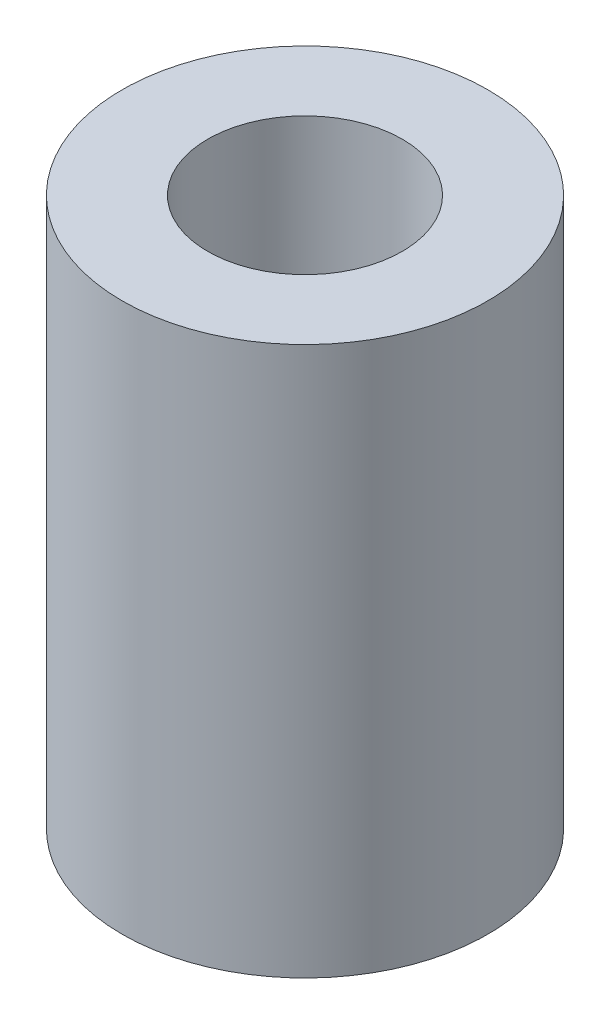
ISO-10303-21;
HEADER;
FILE_DESCRIPTION(('STEP AP214'),'2;1');
FILE_NAME('part.step','',(''),(''),'','','');
FILE_SCHEMA(('AUTOMOTIVE_DESIGN { 1 0 10303 214 1 1 1 1 }'));
ENDSEC;
DATA;
#1=APPLICATION_CONTEXT('core data for automotive mechanical design processes');
#2=APPLICATION_PROTOCOL_DEFINITION('international standard','automotive_design',2000,#1);
#3=PRODUCT_CONTEXT('',#1,'mechanical');
#4=PRODUCT('Part','Part','',(#3));
#5=PRODUCT_RELATED_PRODUCT_CATEGORY('part','',(#4));
#6=PRODUCT_DEFINITION_FORMATION('','',#4);
#7=PRODUCT_DEFINITION_CONTEXT('part definition',#1,'design');
#8=PRODUCT_DEFINITION('design','',#6,#7);
#9=PRODUCT_DEFINITION_SHAPE('','',#8);
#10=(LENGTH_UNIT() NAMED_UNIT(*) SI_UNIT(.MILLI.,.METRE.));
#11=(NAMED_UNIT(*) PLANE_ANGLE_UNIT() SI_UNIT($,.RADIAN.));
#12=(NAMED_UNIT(*) SI_UNIT($,.STERADIAN.) SOLID_ANGLE_UNIT());
#13=UNCERTAINTY_MEASURE_WITH_UNIT(LENGTH_MEASURE(1.E-05),#10,'distance_accuracy_value','');
#14=(GEOMETRIC_REPRESENTATION_CONTEXT(3) GLOBAL_UNCERTAINTY_ASSIGNED_CONTEXT((#13)) GLOBAL_UNIT_ASSIGNED_CONTEXT((#10,
#11,#12)) REPRESENTATION_CONTEXT('',''));
#15=CARTESIAN_POINT('',(0.,0.,0.));
#16=DIRECTION('',(0.,0.,1.));
#17=DIRECTION('',(1.,0.,0.));
#18=AXIS2_PLACEMENT_3D('',#15,#16,#17);
#19=CARTESIAN_POINT('',(0.,19.05,0.));
#20=DIRECTION('',(0.,1.,0.));
#21=DIRECTION('',(0.,0.,1.));
#22=AXIS2_PLACEMENT_3D('',#19,#20,#21);
#23=PLANE('',#22);
#24=CARTESIAN_POINT('',(0.,19.05,0.));
#25=DIRECTION('',(0.,1.,0.));
#26=DIRECTION('',(0.,0.,1.));
#27=AXIS2_PLACEMENT_3D('',#24,#25,#26);
#28=CIRCLE('',#27,6.35);
#29=CARTESIAN_POINT('',(0.,19.05,-6.35));
#30=VERTEX_POINT('',#29);
#31=EDGE_CURVE('E10',#30,#30,#28,.T.);
#32=ORIENTED_EDGE('',*,*,#31,.T.);
#33=EDGE_LOOP('',(#32));
#34=FACE_BOUND('',#33,.T.);
#35=CARTESIAN_POINT('',(0.,19.05,0.));
#36=DIRECTION('',(0.,1.,0.));
#37=DIRECTION('',(0.,0.,1.));
#38=AXIS2_PLACEMENT_3D('',#35,#36,#37);
#39=CIRCLE('',#38,3.3782);
#40=CARTESIAN_POINT('',(0.,19.05,-3.3782));
#41=VERTEX_POINT('',#40);
#42=EDGE_CURVE('E41',#41,#41,#39,.T.);
#43=ORIENTED_EDGE('',*,*,#42,.F.);
#44=EDGE_LOOP('',(#43));
#45=FACE_BOUND('',#44,.T.);
#46=ADVANCED_FACE('F30',(#34,#45),#23,.T.);
#47=CARTESIAN_POINT('',(0.,0.,0.));
#48=DIRECTION('',(0.,1.,0.));
#49=DIRECTION('',(0.,0.,1.));
#50=AXIS2_PLACEMENT_3D('',#47,#48,#49);
#51=PLANE('',#50);
#52=CARTESIAN_POINT('',(0.,0.,0.));
#53=DIRECTION('',(0.,1.,0.));
#54=DIRECTION('',(0.,0.,1.));
#55=AXIS2_PLACEMENT_3D('',#52,#53,#54);
#56=CIRCLE('',#55,6.35);
#57=CARTESIAN_POINT('',(0.,0.,-6.35));
#58=VERTEX_POINT('',#57);
#59=EDGE_CURVE('E34',#58,#58,#56,.T.);
#60=ORIENTED_EDGE('',*,*,#59,.F.);
#61=EDGE_LOOP('',(#60));
#62=FACE_BOUND('',#61,.T.);
#63=CARTESIAN_POINT('',(0.,0.,0.));
#64=DIRECTION('',(0.,1.,0.));
#65=DIRECTION('',(0.,0.,1.));
#66=AXIS2_PLACEMENT_3D('',#63,#64,#65);
#67=CIRCLE('',#66,3.3782);
#68=CARTESIAN_POINT('',(0.,0.,-3.3782));
#69=VERTEX_POINT('',#68);
#70=EDGE_CURVE('E43',#69,#69,#67,.T.);
#71=ORIENTED_EDGE('',*,*,#70,.T.);
#72=EDGE_LOOP('',(#71));
#73=FACE_BOUND('',#72,.T.);
#74=ADVANCED_FACE('F53',(#62,#73),#51,.F.);
#75=CARTESIAN_POINT('',(0.,19.05,0.));
#76=DIRECTION('',(0.,-1.,0.));
#77=DIRECTION('',(0.,0.,-1.));
#78=AXIS2_PLACEMENT_3D('',#75,#76,#77);
#79=CYLINDRICAL_SURFACE('',#78,6.35);
#80=CARTESIAN_POINT('',(0.,19.05,-6.35));
#81=CARTESIAN_POINT('',(0.,18.8515625,-6.35));
#82=CARTESIAN_POINT('',(0.,18.653125,-6.35));
#83=CARTESIAN_POINT('',(0.,18.25625,-6.35));
#84=CARTESIAN_POINT('',(0.,18.0578125,-6.35));
#85=CARTESIAN_POINT('',(0.,17.6609375,-6.35));
#86=CARTESIAN_POINT('',(0.,17.4625,-6.35));
#87=CARTESIAN_POINT('',(0.,17.065625,-6.35));
#88=CARTESIAN_POINT('',(0.,16.8671875,-6.35));
#89=CARTESIAN_POINT('',(0.,16.4703125,-6.35));
#90=CARTESIAN_POINT('',(0.,16.271875,-6.35));
#91=CARTESIAN_POINT('',(0.,15.875,-6.35));
#92=CARTESIAN_POINT('',(0.,15.6765625,-6.35));
#93=CARTESIAN_POINT('',(0.,15.2796875,-6.35));
#94=CARTESIAN_POINT('',(0.,15.08125,-6.35));
#95=CARTESIAN_POINT('',(0.,14.684375,-6.35));
#96=CARTESIAN_POINT('',(0.,14.4859375,-6.35));
#97=CARTESIAN_POINT('',(0.,14.0890625,-6.35));
#98=CARTESIAN_POINT('',(0.,13.890625,-6.35));
#99=CARTESIAN_POINT('',(0.,13.49375,-6.35));
#100=CARTESIAN_POINT('',(0.,13.2953125,-6.35));
#101=CARTESIAN_POINT('',(0.,12.8984375,-6.35));
#102=CARTESIAN_POINT('',(0.,12.7,-6.35));
#103=CARTESIAN_POINT('',(0.,12.303125,-6.35));
#104=CARTESIAN_POINT('',(0.,12.1046875,-6.35));
#105=CARTESIAN_POINT('',(0.,11.7078125,-6.35));
#106=CARTESIAN_POINT('',(0.,11.509375,-6.35));
#107=CARTESIAN_POINT('',(0.,11.1125,-6.35));
#108=CARTESIAN_POINT('',(0.,10.9140625,-6.35));
#109=CARTESIAN_POINT('',(0.,10.5171875,-6.35));
#110=CARTESIAN_POINT('',(0.,10.31875,-6.35));
#111=CARTESIAN_POINT('',(0.,9.921875,-6.35));
#112=CARTESIAN_POINT('',(0.,9.7234375,-6.35));
#113=CARTESIAN_POINT('',(0.,9.3265625,-6.35));
#114=CARTESIAN_POINT('',(0.,9.128125,-6.35));
#115=CARTESIAN_POINT('',(0.,8.73125,-6.35));
#116=CARTESIAN_POINT('',(0.,8.5328125,-6.35));
#117=CARTESIAN_POINT('',(0.,8.1359375,-6.35));
#118=CARTESIAN_POINT('',(0.,7.9375,-6.35));
#119=CARTESIAN_POINT('',(0.,7.540625,-6.35));
#120=CARTESIAN_POINT('',(0.,7.3421875,-6.35));
#121=CARTESIAN_POINT('',(0.,6.9453125,-6.35));
#122=CARTESIAN_POINT('',(0.,6.746875,-6.35));
#123=CARTESIAN_POINT('',(0.,6.35,-6.35));
#124=CARTESIAN_POINT('',(0.,6.1515625,-6.35));
#125=CARTESIAN_POINT('',(0.,5.7546875,-6.35));
#126=CARTESIAN_POINT('',(0.,5.55625,-6.35));
#127=CARTESIAN_POINT('',(0.,5.159375,-6.35));
#128=CARTESIAN_POINT('',(0.,4.9609375,-6.35));
#129=CARTESIAN_POINT('',(0.,4.5640625,-6.35));
#130=CARTESIAN_POINT('',(0.,4.365625,-6.35));
#131=CARTESIAN_POINT('',(0.,3.96875,-6.35));
#132=CARTESIAN_POINT('',(0.,3.7703125,-6.35));
#133=CARTESIAN_POINT('',(0.,3.3734375,-6.35));
#134=CARTESIAN_POINT('',(0.,3.175,-6.35));
#135=CARTESIAN_POINT('',(0.,2.778125,-6.35));
#136=CARTESIAN_POINT('',(0.,2.5796875,-6.35));
#137=CARTESIAN_POINT('',(0.,2.1828125,-6.35));
#138=CARTESIAN_POINT('',(0.,1.984375,-6.35));
#139=CARTESIAN_POINT('',(0.,1.5875,-6.35));
#140=CARTESIAN_POINT('',(0.,1.3890625,-6.35));
#141=CARTESIAN_POINT('',(0.,0.992187500000001,-6.35));
#142=CARTESIAN_POINT('',(0.,0.793750000000001,-6.35));
#143=CARTESIAN_POINT('',(0.,0.396875,-6.35));
#144=CARTESIAN_POINT('',(0.,0.1984375,-6.35));
#145=CARTESIAN_POINT('',(0.,0.,-6.35));
#146=B_SPLINE_CURVE_WITH_KNOTS('',3,(#80,#81,#82,#83,#84,#85,#86,#87,#88,#89,#90,#91,#92,#93,
#94,#95,#96,#97,#98,#99,#100,#101,#102,#103,#104,#105,#106,#107,#108,#109,#110,#111,#112,#113,
#114,#115,#116,#117,#118,#119,#120,#121,#122,#123,#124,#125,#126,#127,#128,#129,#130,#131,#132,
#133,#134,#135,#136,#137,#138,#139,#140,#141,#142,#143,#144,#145),.UNSPECIFIED.,.F.,.F.,(4,2,2,
2,2,2,2,2,2,2,2,2,2,2,2,2,2,2,2,2,2,2,2,2,2,2,2,2,2,2,2,2,4),(0.,0.5953125,1.190625,1.7859375,
2.38125,2.9765625,3.571875,4.1671875,4.7625,5.3578125,5.953125,6.5484375,7.14375,7.7390625,
8.334375,8.9296875,9.525,10.1203125,10.715625,11.3109375,11.90625,12.5015625,13.096875,
13.6921875,14.2875,14.8828125,15.478125,16.0734375,16.66875,17.2640625,17.859375,18.4546875,
19.05),.UNSPECIFIED.);
#147=EDGE_CURVE('BSEAM32',#30,#58,#146,.T.);
#148=ORIENTED_EDGE('',*,*,#31,.F.);
#149=ORIENTED_EDGE('',*,*,#59,.T.);
#150=ORIENTED_EDGE('',*,*,#147,.T.);
#151=ORIENTED_EDGE('',*,*,#147,.F.);
#152=EDGE_LOOP('',(#148,#150,#149,#151));
#153=FACE_BOUND('',#152,.T.);
#154=ADVANCED_FACE('F32',(#153),#79,.T.);
#155=CARTESIAN_POINT('',(0.,19.05,0.));
#156=DIRECTION('',(0.,-1.,0.));
#157=DIRECTION('',(0.,0.,-1.));
#158=AXIS2_PLACEMENT_3D('',#155,#156,#157);
#159=CYLINDRICAL_SURFACE('',#158,3.3782);
#160=CARTESIAN_POINT('',(0.,19.05,-3.3782));
#161=CARTESIAN_POINT('',(0.,18.8515625,-3.3782));
#162=CARTESIAN_POINT('',(0.,18.653125,-3.3782));
#163=CARTESIAN_POINT('',(0.,18.25625,-3.3782));
#164=CARTESIAN_POINT('',(0.,18.0578125,-3.3782));
#165=CARTESIAN_POINT('',(0.,17.6609375,-3.3782));
#166=CARTESIAN_POINT('',(0.,17.4625,-3.3782));
#167=CARTESIAN_POINT('',(0.,17.065625,-3.3782));
#168=CARTESIAN_POINT('',(0.,16.8671875,-3.3782));
#169=CARTESIAN_POINT('',(0.,16.4703125,-3.3782));
#170=CARTESIAN_POINT('',(0.,16.271875,-3.3782));
#171=CARTESIAN_POINT('',(0.,15.875,-3.3782));
#172=CARTESIAN_POINT('',(0.,15.6765625,-3.3782));
#173=CARTESIAN_POINT('',(0.,15.2796875,-3.3782));
#174=CARTESIAN_POINT('',(0.,15.08125,-3.3782));
#175=CARTESIAN_POINT('',(0.,14.684375,-3.3782));
#176=CARTESIAN_POINT('',(0.,14.4859375,-3.3782));
#177=CARTESIAN_POINT('',(0.,14.0890625,-3.3782));
#178=CARTESIAN_POINT('',(0.,13.890625,-3.3782));
#179=CARTESIAN_POINT('',(0.,13.49375,-3.3782));
#180=CARTESIAN_POINT('',(0.,13.2953125,-3.3782));
#181=CARTESIAN_POINT('',(0.,12.8984375,-3.3782));
#182=CARTESIAN_POINT('',(0.,12.7,-3.3782));
#183=CARTESIAN_POINT('',(0.,12.303125,-3.3782));
#184=CARTESIAN_POINT('',(0.,12.1046875,-3.3782));
#185=CARTESIAN_POINT('',(0.,11.7078125,-3.3782));
#186=CARTESIAN_POINT('',(0.,11.509375,-3.3782));
#187=CARTESIAN_POINT('',(0.,11.1125,-3.3782));
#188=CARTESIAN_POINT('',(0.,10.9140625,-3.3782));
#189=CARTESIAN_POINT('',(0.,10.5171875,-3.3782));
#190=CARTESIAN_POINT('',(0.,10.31875,-3.3782));
#191=CARTESIAN_POINT('',(0.,9.921875,-3.3782));
#192=CARTESIAN_POINT('',(0.,9.7234375,-3.3782));
#193=CARTESIAN_POINT('',(0.,9.3265625,-3.3782));
#194=CARTESIAN_POINT('',(0.,9.128125,-3.3782));
#195=CARTESIAN_POINT('',(0.,8.73125,-3.3782));
#196=CARTESIAN_POINT('',(0.,8.5328125,-3.3782));
#197=CARTESIAN_POINT('',(0.,8.1359375,-3.3782));
#198=CARTESIAN_POINT('',(0.,7.9375,-3.3782));
#199=CARTESIAN_POINT('',(0.,7.540625,-3.3782));
#200=CARTESIAN_POINT('',(0.,7.3421875,-3.3782));
#201=CARTESIAN_POINT('',(0.,6.9453125,-3.3782));
#202=CARTESIAN_POINT('',(0.,6.746875,-3.3782));
#203=CARTESIAN_POINT('',(0.,6.35,-3.3782));
#204=CARTESIAN_POINT('',(0.,6.1515625,-3.3782));
#205=CARTESIAN_POINT('',(0.,5.7546875,-3.3782));
#206=CARTESIAN_POINT('',(0.,5.55625,-3.3782));
#207=CARTESIAN_POINT('',(0.,5.159375,-3.3782));
#208=CARTESIAN_POINT('',(0.,4.9609375,-3.3782));
#209=CARTESIAN_POINT('',(0.,4.5640625,-3.3782));
#210=CARTESIAN_POINT('',(0.,4.365625,-3.3782));
#211=CARTESIAN_POINT('',(0.,3.96875,-3.3782));
#212=CARTESIAN_POINT('',(0.,3.7703125,-3.3782));
#213=CARTESIAN_POINT('',(0.,3.3734375,-3.3782));
#214=CARTESIAN_POINT('',(0.,3.175,-3.3782));
#215=CARTESIAN_POINT('',(0.,2.778125,-3.3782));
#216=CARTESIAN_POINT('',(0.,2.5796875,-3.3782));
#217=CARTESIAN_POINT('',(0.,2.1828125,-3.3782));
#218=CARTESIAN_POINT('',(0.,1.984375,-3.3782));
#219=CARTESIAN_POINT('',(0.,1.5875,-3.3782));
#220=CARTESIAN_POINT('',(0.,1.3890625,-3.3782));
#221=CARTESIAN_POINT('',(0.,0.992187500000001,-3.3782));
#222=CARTESIAN_POINT('',(0.,0.793750000000001,-3.3782));
#223=CARTESIAN_POINT('',(0.,0.396875,-3.3782));
#224=CARTESIAN_POINT('',(0.,0.1984375,-3.3782));
#225=CARTESIAN_POINT('',(0.,0.,-3.3782));
#226=B_SPLINE_CURVE_WITH_KNOTS('',3,(#160,#161,#162,#163,#164,#165,#166,#167,#168,#169,#170,
#171,#172,#173,#174,#175,#176,#177,#178,#179,#180,#181,#182,#183,#184,#185,#186,#187,#188,#189,
#190,#191,#192,#193,#194,#195,#196,#197,#198,#199,#200,#201,#202,#203,#204,#205,#206,#207,#208,
#209,#210,#211,#212,#213,#214,#215,#216,#217,#218,#219,#220,#221,#222,#223,#224,#225),
.UNSPECIFIED.,.F.,.F.,(4,2,2,2,2,2,2,2,2,2,2,2,2,2,2,2,2,2,2,2,2,2,2,2,2,2,2,2,2,2,2,2,4),(0.,
0.5953125,1.190625,1.7859375,2.38125,2.9765625,3.571875,4.1671875,4.7625,5.3578125,5.953125,
6.5484375,7.14375,7.7390625,8.334375,8.9296875,9.525,10.1203125,10.715625,11.3109375,11.90625,
12.5015625,13.096875,13.6921875,14.2875,14.8828125,15.478125,16.0734375,16.66875,17.2640625,
17.859375,18.4546875,19.05),.UNSPECIFIED.);
#227=EDGE_CURVE('BSEAM49',#41,#69,#226,.T.);
#228=ORIENTED_EDGE('',*,*,#42,.T.);
#229=ORIENTED_EDGE('',*,*,#70,.F.);
#230=ORIENTED_EDGE('',*,*,#227,.T.);
#231=ORIENTED_EDGE('',*,*,#227,.F.);
#232=EDGE_LOOP('',(#228,#230,#229,#231));
#233=FACE_BOUND('',#232,.T.);
#234=ADVANCED_FACE('F49',(#233),#159,.F.);
#235=CLOSED_SHELL('',(#46,#74,#154,#234));
#236=MANIFOLD_SOLID_BREP('B2',#235);
#237=ADVANCED_BREP_SHAPE_REPRESENTATION('',(#18,#236),#14);
#238=SHAPE_DEFINITION_REPRESENTATION(#9,#237);
ENDSEC;
END-ISO-10303-21;
